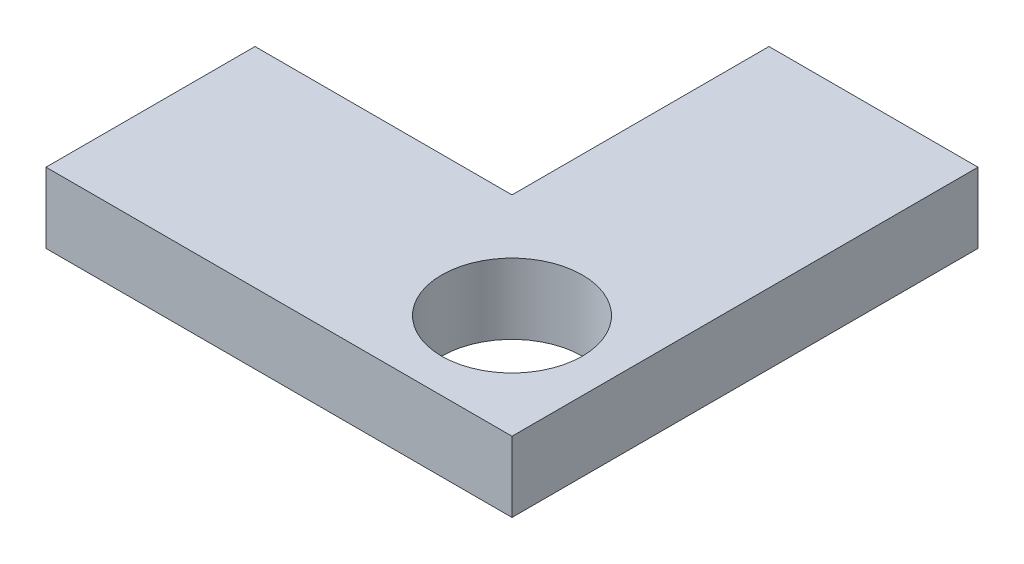
ISO-10303-21;
HEADER;
FILE_DESCRIPTION(('STEP AP214'),'2;1');
FILE_NAME('part.step','',(''),(''),'','','');
FILE_SCHEMA(('AUTOMOTIVE_DESIGN { 1 0 10303 214 1 1 1 1 }'));
ENDSEC;
DATA;
#1=APPLICATION_CONTEXT('core data for automotive mechanical design processes');
#2=APPLICATION_PROTOCOL_DEFINITION('international standard','automotive_design',2000,#1);
#3=PRODUCT_CONTEXT('',#1,'mechanical');
#4=PRODUCT('Part','Part','',(#3));
#5=PRODUCT_RELATED_PRODUCT_CATEGORY('part','',(#4));
#6=PRODUCT_DEFINITION_FORMATION('','',#4);
#7=PRODUCT_DEFINITION_CONTEXT('part definition',#1,'design');
#8=PRODUCT_DEFINITION('design','',#6,#7);
#9=PRODUCT_DEFINITION_SHAPE('','',#8);
#10=(LENGTH_UNIT() NAMED_UNIT(*) SI_UNIT(.MILLI.,.METRE.));
#11=(NAMED_UNIT(*) PLANE_ANGLE_UNIT() SI_UNIT($,.RADIAN.));
#12=(NAMED_UNIT(*) SI_UNIT($,.STERADIAN.) SOLID_ANGLE_UNIT());
#13=UNCERTAINTY_MEASURE_WITH_UNIT(LENGTH_MEASURE(1.E-05),#10,'distance_accuracy_value','');
#14=(GEOMETRIC_REPRESENTATION_CONTEXT(3) GLOBAL_UNCERTAINTY_ASSIGNED_CONTEXT((#13)) GLOBAL_UNIT_ASSIGNED_CONTEXT((#10,
#11,#12)) REPRESENTATION_CONTEXT('',''));
#15=CARTESIAN_POINT('',(0.,0.,0.));
#16=DIRECTION('',(0.,0.,1.));
#17=DIRECTION('',(1.,0.,0.));
#18=AXIS2_PLACEMENT_3D('',#15,#16,#17);
#19=CARTESIAN_POINT('',(0.,5.,0.));
#20=DIRECTION('',(0.,-1.,0.));
#21=DIRECTION('',(0.,0.,-1.));
#22=AXIS2_PLACEMENT_3D('',#19,#20,#21);
#23=PLANE('',#22);
#24=DIRECTION('',(0.,0.,1.));
#25=VECTOR('',#24,1.);
#26=CARTESIAN_POINT('',(-25.6822961509787,5.,7.42438204085044));
#27=LINE('',#26,#25);
#28=CARTESIAN_POINT('',(-25.6822961509787,5.,-7.42438204085044));
#29=VERTEX_POINT('',#28);
#30=CARTESIAN_POINT('',(-25.6822961509787,5.,7.42438204085044));
#31=VERTEX_POINT('',#30);
#32=EDGE_CURVE('E146',#29,#31,#27,.T.);
#33=ORIENTED_EDGE('',*,*,#32,.T.);
#34=DIRECTION('',(1.,0.,0.));
#35=VECTOR('',#34,1.);
#36=CARTESIAN_POINT('',(7.42438204085047,5.,7.42438204085043));
#37=LINE('',#36,#35);
#38=CARTESIAN_POINT('',(7.42438204085047,5.,7.42438204085043));
#39=VERTEX_POINT('',#38);
#40=EDGE_CURVE('E94',#31,#39,#37,.T.);
#41=ORIENTED_EDGE('',*,*,#40,.T.);
#42=DIRECTION('',(0.,0.,-1.));
#43=VECTOR('',#42,1.);
#44=CARTESIAN_POINT('',(7.42438204085033,5.,-25.6822961509787));
#45=LINE('',#44,#43);
#46=CARTESIAN_POINT('',(7.42438204085033,5.,-25.6822961509787));
#47=VERTEX_POINT('',#46);
#48=EDGE_CURVE('E107',#39,#47,#45,.T.);
#49=ORIENTED_EDGE('',*,*,#48,.T.);
#50=DIRECTION('',(-1.,0.,0.));
#51=VECTOR('',#50,1.);
#52=CARTESIAN_POINT('',(-7.42438204085053,5.,-25.6822961509787));
#53=LINE('',#52,#51);
#54=CARTESIAN_POINT('',(-7.42438204085053,5.,-25.6822961509787));
#55=VERTEX_POINT('',#54);
#56=EDGE_CURVE('E101',#47,#55,#53,.T.);
#57=ORIENTED_EDGE('',*,*,#56,.T.);
#58=DIRECTION('',(0.,0.,1.));
#59=VECTOR('',#58,1.);
#60=CARTESIAN_POINT('',(-7.42438204085046,5.,-7.42438204085044));
#61=LINE('',#60,#59);
#62=CARTESIAN_POINT('',(-7.42438204085046,5.,-7.42438204085044));
#63=VERTEX_POINT('',#62);
#64=EDGE_CURVE('E105',#55,#63,#61,.T.);
#65=ORIENTED_EDGE('',*,*,#64,.T.);
#66=DIRECTION('',(-1.,0.,0.));
#67=VECTOR('',#66,1.);
#68=CARTESIAN_POINT('',(-25.6822961509787,5.,-7.42438204085044));
#69=LINE('',#68,#67);
#70=EDGE_CURVE('E57',#63,#29,#69,.T.);
#71=ORIENTED_EDGE('',*,*,#70,.T.);
#72=EDGE_LOOP('',(#33,#41,#49,#57,#65,#71));
#73=FACE_BOUND('',#72,.T.);
#74=CARTESIAN_POINT('',(0.,5.,0.));
#75=DIRECTION('',(0.,1.,0.));
#76=DIRECTION('',(0.,0.,1.));
#77=AXIS2_PLACEMENT_3D('',#74,#75,#76);
#78=CIRCLE('',#77,5.);
#79=CARTESIAN_POINT('',(0.,5.,5.));
#80=VERTEX_POINT('',#79);
#81=EDGE_CURVE('E134',#80,#80,#78,.T.);
#82=ORIENTED_EDGE('',*,*,#81,.F.);
#83=EDGE_LOOP('',(#82));
#84=FACE_BOUND('',#83,.T.);
#85=ADVANCED_FACE('F39',(#73,#84),#23,.F.);
#86=CARTESIAN_POINT('',(0.,0.,0.));
#87=DIRECTION('',(0.,-1.,0.));
#88=DIRECTION('',(0.,0.,-1.));
#89=AXIS2_PLACEMENT_3D('',#86,#87,#88);
#90=PLANE('',#89);
#91=DIRECTION('',(0.,0.,1.));
#92=VECTOR('',#91,1.);
#93=CARTESIAN_POINT('',(-25.6822961509787,0.,7.42438204085044));
#94=LINE('',#93,#92);
#95=CARTESIAN_POINT('',(-25.6822961509787,0.,-7.42438204085044));
#96=VERTEX_POINT('',#95);
#97=CARTESIAN_POINT('',(-25.6822961509787,0.,7.42438204085044));
#98=VERTEX_POINT('',#97);
#99=EDGE_CURVE('E129',#96,#98,#94,.T.);
#100=ORIENTED_EDGE('',*,*,#99,.F.);
#101=DIRECTION('',(-1.,0.,0.));
#102=VECTOR('',#101,1.);
#103=CARTESIAN_POINT('',(-25.6822961509787,0.,-7.42438204085044));
#104=LINE('',#103,#102);
#105=CARTESIAN_POINT('',(-7.42438204085046,0.,-7.42438204085044));
#106=VERTEX_POINT('',#105);
#107=EDGE_CURVE('E86',#106,#96,#104,.T.);
#108=ORIENTED_EDGE('',*,*,#107,.F.);
#109=DIRECTION('',(0.,0.,1.));
#110=VECTOR('',#109,1.);
#111=CARTESIAN_POINT('',(-7.42438204085046,0.,-7.42438204085044));
#112=LINE('',#111,#110);
#113=CARTESIAN_POINT('',(-7.42438204085053,0.,-25.6822961509787));
#114=VERTEX_POINT('',#113);
#115=EDGE_CURVE('E80',#114,#106,#112,.T.);
#116=ORIENTED_EDGE('',*,*,#115,.F.);
#117=DIRECTION('',(-1.,0.,0.));
#118=VECTOR('',#117,1.);
#119=CARTESIAN_POINT('',(-7.42438204085053,0.,-25.6822961509787));
#120=LINE('',#119,#118);
#121=CARTESIAN_POINT('',(7.42438204085033,0.,-25.6822961509787));
#122=VERTEX_POINT('',#121);
#123=EDGE_CURVE('E116',#122,#114,#120,.T.);
#124=ORIENTED_EDGE('',*,*,#123,.F.);
#125=DIRECTION('',(0.,0.,-1.));
#126=VECTOR('',#125,1.);
#127=CARTESIAN_POINT('',(7.42438204085033,0.,-25.6822961509787));
#128=LINE('',#127,#126);
#129=CARTESIAN_POINT('',(7.42438204085047,0.,7.42438204085043));
#130=VERTEX_POINT('',#129);
#131=EDGE_CURVE('E137',#130,#122,#128,.T.);
#132=ORIENTED_EDGE('',*,*,#131,.F.);
#133=DIRECTION('',(1.,0.,0.));
#134=VECTOR('',#133,1.);
#135=CARTESIAN_POINT('',(7.42438204085047,0.,7.42438204085043));
#136=LINE('',#135,#134);
#137=EDGE_CURVE('E133',#98,#130,#136,.T.);
#138=ORIENTED_EDGE('',*,*,#137,.F.);
#139=EDGE_LOOP('',(#100,#108,#116,#124,#132,#138));
#140=FACE_BOUND('',#139,.T.);
#141=CARTESIAN_POINT('',(0.,0.,0.));
#142=DIRECTION('',(0.,1.,0.));
#143=DIRECTION('',(0.,0.,1.));
#144=AXIS2_PLACEMENT_3D('',#141,#142,#143);
#145=CIRCLE('',#144,5.);
#146=CARTESIAN_POINT('',(0.,0.,5.));
#147=VERTEX_POINT('',#146);
#148=EDGE_CURVE('E243',#147,#147,#145,.T.);
#149=ORIENTED_EDGE('',*,*,#148,.T.);
#150=EDGE_LOOP('',(#149));
#151=FACE_BOUND('',#150,.T.);
#152=ADVANCED_FACE('F159',(#140,#151),#90,.T.);
#153=CARTESIAN_POINT('',(-25.6822961509787,5.,7.42438204085044));
#154=DIRECTION('',(1.,0.,0.));
#155=DIRECTION('',(0.,0.,-1.));
#156=AXIS2_PLACEMENT_3D('',#153,#154,#155);
#157=PLANE('',#156);
#158=ORIENTED_EDGE('',*,*,#99,.T.);
#159=DIRECTION('',(0.,-1.,0.));
#160=VECTOR('',#159,1.);
#161=CARTESIAN_POINT('',(-25.6822961509787,5.,7.42438204085044));
#162=LINE('',#161,#160);
#163=EDGE_CURVE('E11',#31,#98,#162,.T.);
#164=ORIENTED_EDGE('',*,*,#163,.F.);
#165=ORIENTED_EDGE('',*,*,#32,.F.);
#166=DIRECTION('',(0.,-1.,0.));
#167=VECTOR('',#166,1.);
#168=CARTESIAN_POINT('',(-25.6822961509787,5.,-7.42438204085044));
#169=LINE('',#168,#167);
#170=EDGE_CURVE('E125',#29,#96,#169,.T.);
#171=ORIENTED_EDGE('',*,*,#170,.T.);
#172=EDGE_LOOP('',(#158,#164,#165,#171));
#173=FACE_BOUND('',#172,.T.);
#174=ADVANCED_FACE('F41',(#173),#157,.F.);
#175=CARTESIAN_POINT('',(7.42438204085047,5.,7.42438204085043));
#176=DIRECTION('',(0.,0.,-1.));
#177=DIRECTION('',(-1.,0.,0.));
#178=AXIS2_PLACEMENT_3D('',#175,#176,#177);
#179=PLANE('',#178);
#180=ORIENTED_EDGE('',*,*,#137,.T.);
#181=DIRECTION('',(0.,-1.,0.));
#182=VECTOR('',#181,1.);
#183=CARTESIAN_POINT('',(7.42438204085047,5.,7.42438204085043));
#184=LINE('',#183,#182);
#185=EDGE_CURVE('E49',#39,#130,#184,.T.);
#186=ORIENTED_EDGE('',*,*,#185,.F.);
#187=ORIENTED_EDGE('',*,*,#40,.F.);
#188=ORIENTED_EDGE('',*,*,#163,.T.);
#189=EDGE_LOOP('',(#180,#186,#187,#188));
#190=FACE_BOUND('',#189,.T.);
#191=ADVANCED_FACE('F184',(#190),#179,.F.);
#192=CARTESIAN_POINT('',(7.42438204085033,5.,-25.6822961509787));
#193=DIRECTION('',(-1.,0.,0.));
#194=DIRECTION('',(0.,0.,1.));
#195=AXIS2_PLACEMENT_3D('',#192,#193,#194);
#196=PLANE('',#195);
#197=ORIENTED_EDGE('',*,*,#131,.T.);
#198=DIRECTION('',(0.,-1.,0.));
#199=VECTOR('',#198,1.);
#200=CARTESIAN_POINT('',(7.42438204085033,5.,-25.6822961509787));
#201=LINE('',#200,#199);
#202=EDGE_CURVE('E118',#47,#122,#201,.T.);
#203=ORIENTED_EDGE('',*,*,#202,.F.);
#204=ORIENTED_EDGE('',*,*,#48,.F.);
#205=ORIENTED_EDGE('',*,*,#185,.T.);
#206=EDGE_LOOP('',(#197,#203,#204,#205));
#207=FACE_BOUND('',#206,.T.);
#208=ADVANCED_FACE('F156',(#207),#196,.F.);
#209=CARTESIAN_POINT('',(-7.42438204085053,5.,-25.6822961509787));
#210=DIRECTION('',(0.,0.,1.));
#211=DIRECTION('',(1.,0.,0.));
#212=AXIS2_PLACEMENT_3D('',#209,#210,#211);
#213=PLANE('',#212);
#214=ORIENTED_EDGE('',*,*,#123,.T.);
#215=DIRECTION('',(0.,-1.,0.));
#216=VECTOR('',#215,1.);
#217=CARTESIAN_POINT('',(-7.42438204085053,5.,-25.6822961509787));
#218=LINE('',#217,#216);
#219=EDGE_CURVE('E113',#55,#114,#218,.T.);
#220=ORIENTED_EDGE('',*,*,#219,.F.);
#221=ORIENTED_EDGE('',*,*,#56,.F.);
#222=ORIENTED_EDGE('',*,*,#202,.T.);
#223=EDGE_LOOP('',(#214,#220,#221,#222));
#224=FACE_BOUND('',#223,.T.);
#225=ADVANCED_FACE('F114',(#224),#213,.F.);
#226=CARTESIAN_POINT('',(-7.42438204085046,5.,-7.42438204085044));
#227=DIRECTION('',(1.,0.,0.));
#228=DIRECTION('',(0.,0.,-1.));
#229=AXIS2_PLACEMENT_3D('',#226,#227,#228);
#230=PLANE('',#229);
#231=ORIENTED_EDGE('',*,*,#115,.T.);
#232=DIRECTION('',(0.,-1.,0.));
#233=VECTOR('',#232,1.);
#234=CARTESIAN_POINT('',(-7.42438204085046,5.,-7.42438204085044));
#235=LINE('',#234,#233);
#236=EDGE_CURVE('E119',#63,#106,#235,.T.);
#237=ORIENTED_EDGE('',*,*,#236,.F.);
#238=ORIENTED_EDGE('',*,*,#64,.F.);
#239=ORIENTED_EDGE('',*,*,#219,.T.);
#240=EDGE_LOOP('',(#231,#237,#238,#239));
#241=FACE_BOUND('',#240,.T.);
#242=ADVANCED_FACE('F121',(#241),#230,.F.);
#243=CARTESIAN_POINT('',(-25.6822961509787,5.,-7.42438204085044));
#244=DIRECTION('',(0.,0.,1.));
#245=DIRECTION('',(1.,0.,0.));
#246=AXIS2_PLACEMENT_3D('',#243,#244,#245);
#247=PLANE('',#246);
#248=ORIENTED_EDGE('',*,*,#107,.T.);
#249=ORIENTED_EDGE('',*,*,#170,.F.);
#250=ORIENTED_EDGE('',*,*,#70,.F.);
#251=ORIENTED_EDGE('',*,*,#236,.T.);
#252=EDGE_LOOP('',(#248,#249,#250,#251));
#253=FACE_BOUND('',#252,.T.);
#254=ADVANCED_FACE('F164',(#253),#247,.F.);
#255=CARTESIAN_POINT('',(0.,5.,0.));
#256=DIRECTION('',(0.,-1.,0.));
#257=DIRECTION('',(0.,0.,-1.));
#258=AXIS2_PLACEMENT_3D('',#255,#256,#257);
#259=CYLINDRICAL_SURFACE('',#258,5.);
#260=ORIENTED_EDGE('',*,*,#81,.T.);
#261=EDGE_LOOP('',(#260));
#262=FACE_BOUND('',#261,.T.);
#263=ORIENTED_EDGE('',*,*,#148,.F.);
#264=EDGE_LOOP('',(#263));
#265=FACE_BOUND('',#264,.T.);
#266=ADVANCED_FACE('F166',(#262,#265),#259,.F.);
#267=CLOSED_SHELL('',(#85,#152,#174,#191,#208,#225,#242,#254,#266));
#268=MANIFOLD_SOLID_BREP('B2',#267);
#269=ADVANCED_BREP_SHAPE_REPRESENTATION('',(#18,#268),#14);
#270=SHAPE_DEFINITION_REPRESENTATION(#9,#269);
ENDSEC;
END-ISO-10303-21;
